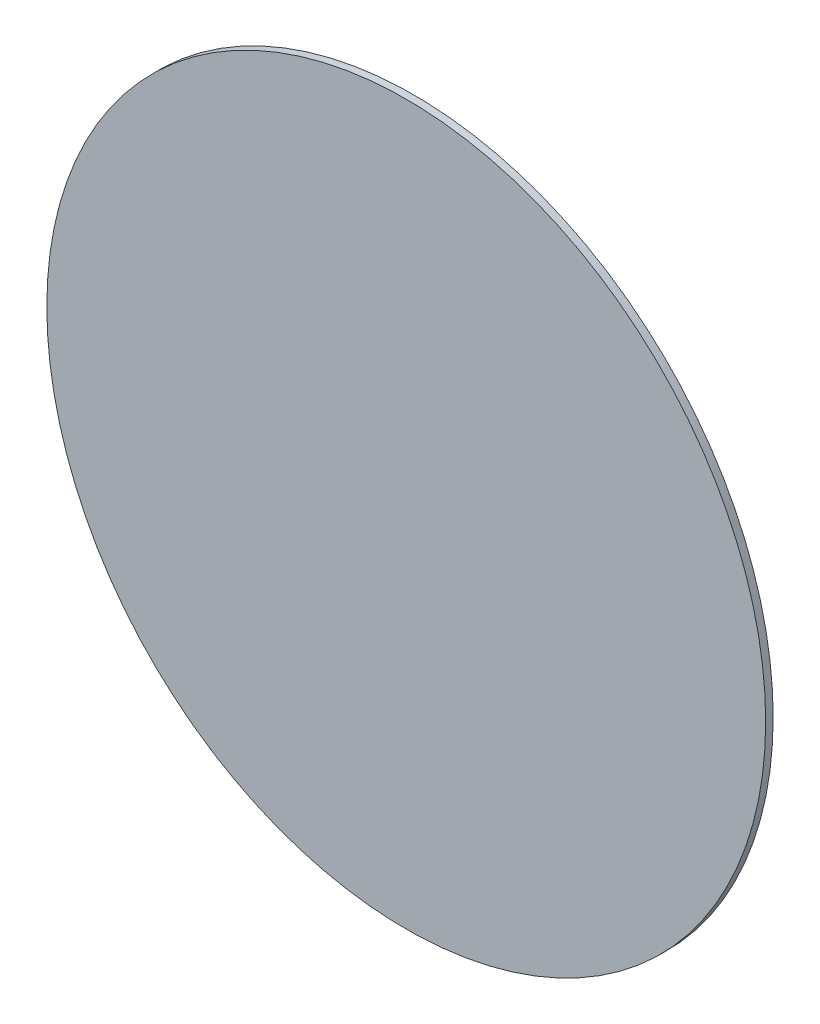
ISO-10303-21;
HEADER;
FILE_DESCRIPTION(('STEP AP214'),'2;1');
FILE_NAME('part.step','',(''),(''),'','','');
FILE_SCHEMA(('AUTOMOTIVE_DESIGN { 1 0 10303 214 1 1 1 1 }'));
ENDSEC;
DATA;
#1=APPLICATION_CONTEXT('core data for automotive mechanical design processes');
#2=APPLICATION_PROTOCOL_DEFINITION('international standard','automotive_design',2000,#1);
#3=PRODUCT_CONTEXT('',#1,'mechanical');
#4=PRODUCT('Part','Part','',(#3));
#5=PRODUCT_RELATED_PRODUCT_CATEGORY('part','',(#4));
#6=PRODUCT_DEFINITION_FORMATION('','',#4);
#7=PRODUCT_DEFINITION_CONTEXT('part definition',#1,'design');
#8=PRODUCT_DEFINITION('design','',#6,#7);
#9=PRODUCT_DEFINITION_SHAPE('','',#8);
#10=(LENGTH_UNIT() NAMED_UNIT(*) SI_UNIT(.MILLI.,.METRE.));
#11=(NAMED_UNIT(*) PLANE_ANGLE_UNIT() SI_UNIT($,.RADIAN.));
#12=(NAMED_UNIT(*) SI_UNIT($,.STERADIAN.) SOLID_ANGLE_UNIT());
#13=UNCERTAINTY_MEASURE_WITH_UNIT(LENGTH_MEASURE(1.E-05),#10,'distance_accuracy_value','');
#14=(GEOMETRIC_REPRESENTATION_CONTEXT(3) GLOBAL_UNCERTAINTY_ASSIGNED_CONTEXT((#13)) GLOBAL_UNIT_ASSIGNED_CONTEXT((#10,
#11,#12)) REPRESENTATION_CONTEXT('',''));
#15=CARTESIAN_POINT('',(0.,0.,0.));
#16=DIRECTION('',(0.,0.,1.));
#17=DIRECTION('',(1.,0.,0.));
#18=AXIS2_PLACEMENT_3D('',#15,#16,#17);
#19=CARTESIAN_POINT('',(0.,0.,-6.));
#20=DIRECTION('',(0.,0.,1.));
#21=DIRECTION('',(-1.,0.,0.));
#22=AXIS2_PLACEMENT_3D('',#19,#20,#21);
#23=CYLINDRICAL_SURFACE('',#22,287.5);
#24=CARTESIAN_POINT('',(0.,0.,-6.));
#25=DIRECTION('',(0.,0.,1.));
#26=DIRECTION('',(1.,0.,0.));
#27=AXIS2_PLACEMENT_3D('',#24,#25,#26);
#28=CIRCLE('',#27,287.5);
#29=CARTESIAN_POINT('',(287.5,0.,-6.));
#30=VERTEX_POINT('',#29);
#31=EDGE_CURVE('E10',#30,#30,#28,.T.);
#32=ORIENTED_EDGE('',*,*,#31,.T.);
#33=EDGE_LOOP('',(#32));
#34=FACE_BOUND('',#33,.T.);
#35=CARTESIAN_POINT('',(0.,0.,0.));
#36=DIRECTION('',(0.,0.,1.));
#37=DIRECTION('',(1.,0.,0.));
#38=AXIS2_PLACEMENT_3D('',#35,#36,#37);
#39=CIRCLE('',#38,287.5);
#40=CARTESIAN_POINT('',(287.5,0.,0.));
#41=VERTEX_POINT('',#40);
#42=EDGE_CURVE('E17',#41,#41,#39,.T.);
#43=ORIENTED_EDGE('',*,*,#42,.F.);
#44=EDGE_LOOP('',(#43));
#45=FACE_BOUND('',#44,.T.);
#46=ADVANCED_FACE('F14',(#34,#45),#23,.T.);
#47=CARTESIAN_POINT('',(0.,0.,-6.));
#48=DIRECTION('',(0.,0.,-1.));
#49=DIRECTION('',(1.,0.,0.));
#50=AXIS2_PLACEMENT_3D('',#47,#48,#49);
#51=PLANE('',#50);
#52=ORIENTED_EDGE('',*,*,#31,.F.);
#53=EDGE_LOOP('',(#52));
#54=FACE_BOUND('',#53,.T.);
#55=ADVANCED_FACE('F29',(#54),#51,.T.);
#56=CARTESIAN_POINT('',(0.,0.,0.));
#57=DIRECTION('',(0.,0.,-1.));
#58=DIRECTION('',(1.,0.,0.));
#59=AXIS2_PLACEMENT_3D('',#56,#57,#58);
#60=PLANE('',#59);
#61=ORIENTED_EDGE('',*,*,#42,.T.);
#62=EDGE_LOOP('',(#61));
#63=FACE_BOUND('',#62,.T.);
#64=ADVANCED_FACE('F26',(#63),#60,.F.);
#65=CLOSED_SHELL('',(#46,#55,#64));
#66=MANIFOLD_SOLID_BREP('B1',#65);
#67=ADVANCED_BREP_SHAPE_REPRESENTATION('',(#18,#66),#14);
#68=SHAPE_DEFINITION_REPRESENTATION(#9,#67);
ENDSEC;
END-ISO-10303-21;
